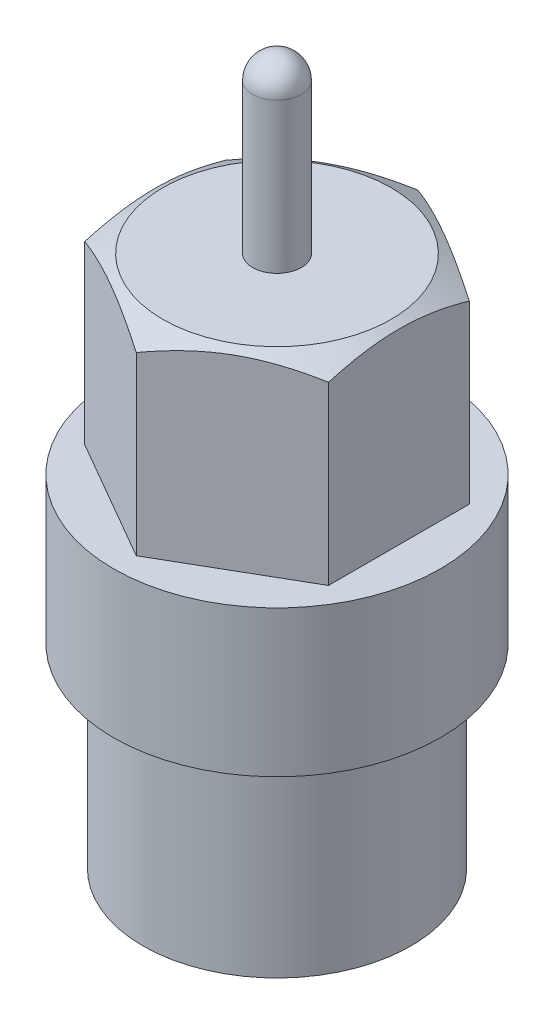
ISO-10303-21;
HEADER;
FILE_DESCRIPTION(('STEP AP214'),'2;1');
FILE_NAME('part.step','',(''),(''),'','','');
FILE_SCHEMA(('AUTOMOTIVE_DESIGN { 1 0 10303 214 1 1 1 1 }'));
ENDSEC;
DATA;
#1=APPLICATION_CONTEXT('core data for automotive mechanical design processes');
#2=APPLICATION_PROTOCOL_DEFINITION('international standard','automotive_design',2000,#1);
#3=PRODUCT_CONTEXT('',#1,'mechanical');
#4=PRODUCT('Part','Part','',(#3));
#5=PRODUCT_RELATED_PRODUCT_CATEGORY('part','',(#4));
#6=PRODUCT_DEFINITION_FORMATION('','',#4);
#7=PRODUCT_DEFINITION_CONTEXT('part definition',#1,'design');
#8=PRODUCT_DEFINITION('design','',#6,#7);
#9=PRODUCT_DEFINITION_SHAPE('','',#8);
#10=(LENGTH_UNIT() NAMED_UNIT(*) SI_UNIT(.MILLI.,.METRE.));
#11=(NAMED_UNIT(*) PLANE_ANGLE_UNIT() SI_UNIT($,.RADIAN.));
#12=(NAMED_UNIT(*) SI_UNIT($,.STERADIAN.) SOLID_ANGLE_UNIT());
#13=UNCERTAINTY_MEASURE_WITH_UNIT(LENGTH_MEASURE(1.E-05),#10,'distance_accuracy_value','');
#14=(GEOMETRIC_REPRESENTATION_CONTEXT(3) GLOBAL_UNCERTAINTY_ASSIGNED_CONTEXT((#13)) GLOBAL_UNIT_ASSIGNED_CONTEXT((#10,
#11,#12)) REPRESENTATION_CONTEXT('',''));
#15=CARTESIAN_POINT('',(0.,0.,0.));
#16=DIRECTION('',(0.,0.,1.));
#17=DIRECTION('',(1.,0.,0.));
#18=AXIS2_PLACEMENT_3D('',#15,#16,#17);
#19=CARTESIAN_POINT('',(-3.,7.,0.));
#20=DIRECTION('',(0.,1.,0.));
#21=DIRECTION('',(0.,0.,1.));
#22=AXIS2_PLACEMENT_3D('',#19,#20,#21);
#23=PLANE('',#22);
#24=CARTESIAN_POINT('',(0.,7.,0.));
#25=DIRECTION('',(0.,1.,0.));
#26=DIRECTION('',(0.,0.,1.));
#27=AXIS2_PLACEMENT_3D('',#24,#25,#26);
#28=CIRCLE('',#27,3.35219169135313);
#29=CARTESIAN_POINT('',(0.,7.,3.35219169135313));
#30=VERTEX_POINT('',#29);
#31=EDGE_CURVE('E134',#30,#30,#28,.T.);
#32=ORIENTED_EDGE('',*,*,#31,.T.);
#33=EDGE_LOOP('',(#32));
#34=FACE_BOUND('',#33,.T.);
#35=DIRECTION('',(-0.866025403784439,0.,0.5));
#36=VECTOR('',#35,1.);
#37=CARTESIAN_POINT('',(0.,7.,2.88675134594813));
#38=LINE('',#37,#36);
#39=CARTESIAN_POINT('',(2.5,7.,1.44337567297406));
#40=VERTEX_POINT('',#39);
#41=CARTESIAN_POINT('',(0.,7.,2.88675134594813));
#42=VERTEX_POINT('',#41);
#43=EDGE_CURVE('E99',#40,#42,#38,.T.);
#44=ORIENTED_EDGE('',*,*,#43,.T.);
#45=DIRECTION('',(-0.866025403784439,0.,-0.5));
#46=VECTOR('',#45,1.);
#47=CARTESIAN_POINT('',(-2.5,7.,1.44337567297406));
#48=LINE('',#47,#46);
#49=CARTESIAN_POINT('',(-2.5,7.,1.44337567297406));
#50=VERTEX_POINT('',#49);
#51=EDGE_CURVE('E91',#42,#50,#48,.T.);
#52=ORIENTED_EDGE('',*,*,#51,.T.);
#53=DIRECTION('',(0.,0.,-1.));
#54=VECTOR('',#53,1.);
#55=CARTESIAN_POINT('',(-2.5,7.,-1.44337567297406));
#56=LINE('',#55,#54);
#57=CARTESIAN_POINT('',(-2.5,7.,-1.44337567297406));
#58=VERTEX_POINT('',#57);
#59=EDGE_CURVE('E98',#50,#58,#56,.T.);
#60=ORIENTED_EDGE('',*,*,#59,.T.);
#61=DIRECTION('',(0.866025403784439,0.,-0.5));
#62=VECTOR('',#61,1.);
#63=CARTESIAN_POINT('',(0.,7.,-2.88675134594813));
#64=LINE('',#63,#62);
#65=CARTESIAN_POINT('',(0.,7.,-2.88675134594813));
#66=VERTEX_POINT('',#65);
#67=EDGE_CURVE('E316',#58,#66,#64,.T.);
#68=ORIENTED_EDGE('',*,*,#67,.T.);
#69=DIRECTION('',(0.866025403784439,0.,0.5));
#70=VECTOR('',#69,1.);
#71=CARTESIAN_POINT('',(2.5,7.,-1.44337567297407));
#72=LINE('',#71,#70);
#73=CARTESIAN_POINT('',(2.5,7.,-1.44337567297407));
#74=VERTEX_POINT('',#73);
#75=EDGE_CURVE('E318',#66,#74,#72,.T.);
#76=ORIENTED_EDGE('',*,*,#75,.T.);
#77=DIRECTION('',(0.,0.,1.));
#78=VECTOR('',#77,1.);
#79=CARTESIAN_POINT('',(2.5,7.,1.44337567297406));
#80=LINE('',#79,#78);
#81=EDGE_CURVE('E109',#74,#40,#80,.T.);
#82=ORIENTED_EDGE('',*,*,#81,.T.);
#83=EDGE_LOOP('',(#44,#52,#60,#68,#76,#82));
#84=FACE_BOUND('',#83,.T.);
#85=ADVANCED_FACE('F35',(#34,#84),#23,.T.);
#86=CARTESIAN_POINT('',(0.,14.9687648993492,0.));
#87=DIRECTION('',(0.,1.,0.));
#88=DIRECTION('',(0.,0.,1.));
#89=AXIS2_PLACEMENT_3D('',#86,#87,#88);
#90=CYLINDRICAL_SURFACE('',#89,3.35219169135313);
#91=CARTESIAN_POINT('',(0.,4.,0.));
#92=DIRECTION('',(0.,1.,0.));
#93=DIRECTION('',(0.,0.,1.));
#94=AXIS2_PLACEMENT_3D('',#91,#92,#93);
#95=CIRCLE('',#94,3.35219169135313);
#96=CARTESIAN_POINT('',(0.,4.,3.35219169135313));
#97=VERTEX_POINT('',#96);
#98=EDGE_CURVE('E131',#97,#97,#95,.T.);
#99=ORIENTED_EDGE('',*,*,#98,.T.);
#100=EDGE_LOOP('',(#99));
#101=FACE_BOUND('',#100,.T.);
#102=ORIENTED_EDGE('',*,*,#31,.F.);
#103=EDGE_LOOP('',(#102));
#104=FACE_BOUND('',#103,.T.);
#105=ADVANCED_FACE('F183',(#101,#104),#90,.T.);
#106=CARTESIAN_POINT('',(-2.75,4.,0.));
#107=DIRECTION('',(0.,-1.,0.));
#108=DIRECTION('',(0.,0.,-1.));
#109=AXIS2_PLACEMENT_3D('',#106,#107,#108);
#110=PLANE('',#109);
#111=CARTESIAN_POINT('',(0.,4.,0.));
#112=DIRECTION('',(0.,1.,0.));
#113=DIRECTION('',(0.,0.,1.));
#114=AXIS2_PLACEMENT_3D('',#111,#112,#113);
#115=CIRCLE('',#114,2.75);
#116=CARTESIAN_POINT('',(0.,4.,2.75));
#117=VERTEX_POINT('',#116);
#118=EDGE_CURVE('E128',#117,#117,#115,.T.);
#119=ORIENTED_EDGE('',*,*,#118,.T.);
#120=EDGE_LOOP('',(#119));
#121=FACE_BOUND('',#120,.T.);
#122=ORIENTED_EDGE('',*,*,#98,.F.);
#123=EDGE_LOOP('',(#122));
#124=FACE_BOUND('',#123,.T.);
#125=ADVANCED_FACE('F179',(#121,#124),#110,.T.);
#126=CARTESIAN_POINT('',(0.,14.9687648993492,0.));
#127=DIRECTION('',(0.,1.,0.));
#128=DIRECTION('',(0.,0.,1.));
#129=AXIS2_PLACEMENT_3D('',#126,#127,#128);
#130=CYLINDRICAL_SURFACE('',#129,2.75);
#131=CARTESIAN_POINT('',(0.,0.,0.));
#132=DIRECTION('',(0.,1.,0.));
#133=DIRECTION('',(0.,0.,1.));
#134=AXIS2_PLACEMENT_3D('',#131,#132,#133);
#135=CIRCLE('',#134,2.75);
#136=CARTESIAN_POINT('',(0.,0.,2.75));
#137=VERTEX_POINT('',#136);
#138=EDGE_CURVE('E125',#137,#137,#135,.T.);
#139=ORIENTED_EDGE('',*,*,#138,.T.);
#140=EDGE_LOOP('',(#139));
#141=FACE_BOUND('',#140,.T.);
#142=ORIENTED_EDGE('',*,*,#118,.F.);
#143=EDGE_LOOP('',(#142));
#144=FACE_BOUND('',#143,.T.);
#145=ADVANCED_FACE('F175',(#141,#144),#130,.T.);
#146=CARTESIAN_POINT('',(-0.531153926896968,0.,0.));
#147=DIRECTION('',(0.,-1.,0.));
#148=DIRECTION('',(0.,0.,-1.));
#149=AXIS2_PLACEMENT_3D('',#146,#147,#148);
#150=PLANE('',#149);
#151=CARTESIAN_POINT('',(0.,0.,0.));
#152=DIRECTION('',(0.,1.,0.));
#153=DIRECTION('',(0.,0.,1.));
#154=AXIS2_PLACEMENT_3D('',#151,#152,#153);
#155=CIRCLE('',#154,0.531153926896968);
#156=CARTESIAN_POINT('',(0.,0.,0.531153926896968));
#157=VERTEX_POINT('',#156);
#158=EDGE_CURVE('E122',#157,#157,#155,.T.);
#159=ORIENTED_EDGE('',*,*,#158,.T.);
#160=EDGE_LOOP('',(#159));
#161=FACE_BOUND('',#160,.T.);
#162=ORIENTED_EDGE('',*,*,#138,.F.);
#163=EDGE_LOOP('',(#162));
#164=FACE_BOUND('',#163,.T.);
#165=ADVANCED_FACE('F172',(#161,#164),#150,.T.);
#166=CARTESIAN_POINT('',(0.,0.,0.));
#167=DIRECTION('',(0.,1.,0.));
#168=DIRECTION('',(0.,0.,1.));
#169=AXIS2_PLACEMENT_3D('',#166,#167,#168);
#170=CONICAL_SURFACE('',#169,0.531153926896968,0.586114206613113);
#171=CARTESIAN_POINT('',(0.,-0.8,0.));
#172=VERTEX_POINT('',#171);
#173=VERTEX_LOOP('',#172);
#174=FACE_BOUND('',#173,.T.);
#175=ORIENTED_EDGE('',*,*,#158,.F.);
#176=EDGE_LOOP('',(#175));
#177=FACE_BOUND('',#176,.T.);
#178=ADVANCED_FACE('F169',(#174,#177),#170,.T.);
#179=CARTESIAN_POINT('',(0.,-2.57624420624372,2.88675134594813));
#180=DIRECTION('',(0.5,0.,0.866025403784438));
#181=DIRECTION('',(0.866025403784439,0.,-0.5));
#182=AXIS2_PLACEMENT_3D('',#179,#180,#181);
#183=PLANE('',#182);
#184=DIRECTION('',(0.,1.,0.));
#185=VECTOR('',#184,1.);
#186=CARTESIAN_POINT('',(0.,-2.57624420624372,2.88675134594813));
#187=LINE('',#186,#185);
#188=CARTESIAN_POINT('',(0.,10.6090012369322,2.88675134594813));
#189=VERTEX_POINT('',#188);
#190=EDGE_CURVE('E54',#42,#189,#187,.T.);
#191=ORIENTED_EDGE('',*,*,#190,.F.);
#192=ORIENTED_EDGE('',*,*,#43,.F.);
#193=DIRECTION('',(0.,1.,0.));
#194=VECTOR('',#193,1.);
#195=CARTESIAN_POINT('',(2.5,-2.57624420624372,1.44337567297406));
#196=LINE('',#195,#194);
#197=CARTESIAN_POINT('',(2.5,10.6090012369322,1.44337567297406));
#198=VERTEX_POINT('',#197);
#199=EDGE_CURVE('E106',#40,#198,#196,.T.);
#200=ORIENTED_EDGE('',*,*,#199,.T.);
#201=CARTESIAN_POINT('',(-0.000199999999998882,10.6089345662657,2.88686681600197));
#202=CARTESIAN_POINT('',(0.109663234734873,10.6455706105172,2.82343724785375));
#203=CARTESIAN_POINT('',(0.220474799896527,10.6788900116597,2.75946016087834));
#204=CARTESIAN_POINT('',(0.444016833466051,10.7370499450669,2.63039810762178));
#205=CARTESIAN_POINT('',(0.55675127452839,10.761869901477,2.5653108477275));
#206=CARTESIAN_POINT('',(0.780822993875271,10.8005065791837,2.43594298024479));
#207=CARTESIAN_POINT('',(0.892125791767379,10.8145804344391,2.37168227992022));
#208=CARTESIAN_POINT('',(1.11525522746834,10.831383078272,2.24285844015415));
#209=CARTESIAN_POINT('',(1.22708105401423,10.8341257794212,2.17829576909552));
#210=CARTESIAN_POINT('',(1.43604197555152,10.8284264706167,2.05765212479586));
#211=CARTESIAN_POINT('',(1.53320831755773,10.8213838362429,2.0015531110824));
#212=CARTESIAN_POINT('',(1.726907949711,10.7990608114998,1.88972057631678));
#213=CARTESIAN_POINT('',(1.82344056965973,10.7837727921845,1.8339874422038));
#214=CARTESIAN_POINT('',(2.01753972174048,10.7455531367804,1.7219242445005));
#215=CARTESIAN_POINT('',(2.11508168178214,10.7224594544993,1.66560836761316));
#216=CARTESIAN_POINT('',(2.30871060807609,10.6700455740469,1.55381665489446));
#217=CARTESIAN_POINT('',(2.40480005588618,10.6407376950002,1.49833938633502));
#218=CARTESIAN_POINT('',(2.5002,10.6089345662657,1.44326020292023));
#219=B_SPLINE_CURVE_WITH_KNOTS('',3,(#201,#202,#203,#204,#205,#206,#207,#208,#209,#210,#211,
#212,#213,#214,#215,#216,#217,#218),.UNSPECIFIED.,.F.,.F.,(4,2,2,2,2,2,2,2,4),(0.,
0.396285827362227,0.793524330152052,1.18093086852114,1.56786160134476,1.90479741793733,
2.24204551660463,2.58677531536756,2.93082800105256),.UNSPECIFIED.);
#220=EDGE_CURVE('E12',#189,#198,#219,.T.);
#221=ORIENTED_EDGE('',*,*,#220,.F.);
#222=EDGE_LOOP('',(#191,#192,#200,#221));
#223=FACE_BOUND('',#222,.T.);
#224=ADVANCED_FACE('F102',(#223),#183,.T.);
#225=CARTESIAN_POINT('',(2.5,-2.57624420624372,1.44337567297406));
#226=DIRECTION('',(1.,0.,0.));
#227=DIRECTION('',(0.,0.,-1.));
#228=AXIS2_PLACEMENT_3D('',#225,#226,#227);
#229=PLANE('',#228);
#230=ORIENTED_EDGE('',*,*,#199,.F.);
#231=ORIENTED_EDGE('',*,*,#81,.F.);
#232=DIRECTION('',(0.,1.,0.));
#233=VECTOR('',#232,1.);
#234=CARTESIAN_POINT('',(2.5,-2.57624420624372,-1.44337567297407));
#235=LINE('',#234,#233);
#236=CARTESIAN_POINT('',(2.5,10.6090012369322,-1.44337567297407));
#237=VERTEX_POINT('',#236);
#238=EDGE_CURVE('E326',#74,#237,#235,.T.);
#239=ORIENTED_EDGE('',*,*,#238,.T.);
#240=CARTESIAN_POINT('',(2.5,9.63775203197999,-3.82436928619818));
#241=CARTESIAN_POINT('',(2.5,9.69029804544711,-3.71560541876863));
#242=CARTESIAN_POINT('',(2.5,9.74232471034108,-3.60658612397464));
#243=CARTESIAN_POINT('',(2.5,9.84504611961405,-3.38790062702491));
#244=CARTESIAN_POINT('',(2.5,9.89574064297451,-3.27823432117214));
#245=CARTESIAN_POINT('',(2.5,9.9957709866026,-3.05752799371934));
#246=CARTESIAN_POINT('',(2.5,10.0450974272333,-2.94648370576985));
#247=CARTESIAN_POINT('',(2.5,10.1416598164791,-2.72349319987992));
#248=CARTESIAN_POINT('',(2.5,10.1888958676455,-2.61154702650374));
#249=CARTESIAN_POINT('',(2.5,10.2821103237927,-2.38317772143622));
#250=CARTESIAN_POINT('',(2.5,10.3280078426014,-2.26672138738359));
#251=CARTESIAN_POINT('',(2.5,10.4161997317468,-2.03242691722103));
#252=CARTESIAN_POINT('',(2.5,10.4584936904934,-1.91458862501114));
#253=CARTESIAN_POINT('',(2.5,10.5383293848891,-1.67758095989367));
#254=CARTESIAN_POINT('',(2.5,10.5758812152851,-1.55841502289388));
#255=CARTESIAN_POINT('',(2.5,10.6449930927758,-1.31837509764331));
#256=CARTESIAN_POINT('',(2.5,10.6765550838859,-1.19750167729124));
#257=CARTESIAN_POINT('',(2.5,10.7319745410874,-0.954635078784878));
#258=CARTESIAN_POINT('',(2.5,10.7558715213596,-0.832651089996438));
#259=CARTESIAN_POINT('',(2.5,10.7945731423488,-0.587223191703026));
#260=CARTESIAN_POINT('',(2.5,10.8093785414912,-0.463779404851219));
#261=CARTESIAN_POINT('',(2.5,10.8285213305091,-0.217637993546147));
#262=CARTESIAN_POINT('',(2.5,10.8329891091422,-0.0949507635763036));
#263=CARTESIAN_POINT('',(2.5,10.8314180689393,0.150364917265022));
#264=CARTESIAN_POINT('',(2.5,10.8253789209815,0.272993366174872));
#265=CARTESIAN_POINT('',(2.5,10.8064790079081,0.482777366490869));
#266=CARTESIAN_POINT('',(2.5,10.7960288976567,0.57016225131682));
#267=CARTESIAN_POINT('',(2.5,10.7704734391882,0.74425493369405));
#268=CARTESIAN_POINT('',(2.5,10.7553674123021,0.830962630644654));
#269=CARTESIAN_POINT('',(2.5,10.7038616567399,1.08996524967496));
#270=CARTESIAN_POINT('',(2.5,10.6612848884131,1.26103505157086));
#271=CARTESIAN_POINT('',(2.5,10.5631715451488,1.60329608713349));
#272=CARTESIAN_POINT('',(2.5,10.5073736982879,1.77440933961331));
#273=CARTESIAN_POINT('',(2.5,10.3871980492575,2.11349114517199));
#274=CARTESIAN_POINT('',(2.5,10.3228228890675,2.28146064848992));
#275=CARTESIAN_POINT('',(2.5,10.2121032928986,2.55553059032251));
#276=CARTESIAN_POINT('',(2.5,10.1675079359126,2.66234918305649));
#277=CARTESIAN_POINT('',(2.5,10.0763256007896,2.87513467073338));
#278=CARTESIAN_POINT('',(2.5,10.0297385893085,2.98110155138173));
#279=CARTESIAN_POINT('',(2.5,9.88758444580172,3.29797019153017));
#280=CARTESIAN_POINT('',(2.5,9.78963946176046,3.50780301085414));
#281=CARTESIAN_POINT('',(2.5,9.58946726527467,3.92562559407122));
#282=CARTESIAN_POINT('',(2.5,9.4872363227355,4.13361355332824));
#283=CARTESIAN_POINT('',(2.5,9.27984883620772,4.54812974436396));
#284=CARTESIAN_POINT('',(2.5,9.17469220435385,4.75465793206823));
#285=CARTESIAN_POINT('',(2.5,8.97060649120626,5.15049181953925));
#286=CARTESIAN_POINT('',(2.5,8.87183503104251,5.33987904901395));
#287=CARTESIAN_POINT('',(2.5,8.6729424574981,5.71794978029189));
#288=CARTESIAN_POINT('',(2.5,8.57282130465768,5.90663326131348));
#289=CARTESIAN_POINT('',(2.5,8.37176381157511,6.28303318956914));
#290=CARTESIAN_POINT('',(2.5,8.27082973915809,6.47075084992785));
#291=CARTESIAN_POINT('',(2.5,8.06814305067557,6.8457321316033));
#292=CARTESIAN_POINT('',(2.5,7.96639047468291,7.03299577457095));
#293=CARTESIAN_POINT('',(2.5,7.86433006891239,7.22009033705315));
#294=B_SPLINE_CURVE_WITH_KNOTS('',3,(#240,#241,#242,#243,#244,#245,#246,#247,#248,#249,#250,
#251,#252,#253,#254,#255,#256,#257,#258,#259,#260,#261,#262,#263,#264,#265,#266,#267,#268,#269,
#270,#271,#272,#273,#274,#275,#276,#277,#278,#279,#280,#281,#282,#283,#284,#285,#286,#287,#288,
#289,#290,#291,#292,#293),.UNSPECIFIED.,.F.,.F.,(4,2,2,2,2,2,2,2,2,2,2,2,2,2,2,2,2,2,2,2,2,2,2,
2,2,2,4),(0.,0.362380137569459,0.724820023600681,1.08932356411329,1.45380920278696,
1.82928670252166,2.20480703107002,2.57951399440462,2.95409913702143,3.32672099191255,
3.6993117582322,4.06717678713954,4.43505333935758,4.69894774861289,4.96288064259475,
5.49106054084683,6.03070636804056,6.57018635643589,6.91742987498311,7.26467920931308,
7.95929771516193,8.65453383857819,9.349790864141,9.99057298691808,10.6313738844753,
11.2707702150302,11.9101354298418),.UNSPECIFIED.);
#295=EDGE_CURVE('E47',#198,#237,#294,.F.);
#296=ORIENTED_EDGE('',*,*,#295,.F.);
#297=EDGE_LOOP('',(#230,#231,#239,#296));
#298=FACE_BOUND('',#297,.T.);
#299=ADVANCED_FACE('F222',(#298),#229,.T.);
#300=CARTESIAN_POINT('',(2.5,-2.57624420624372,-1.44337567297407));
#301=DIRECTION('',(0.5,0.,-0.866025403784439));
#302=DIRECTION('',(-0.866025403784439,0.,-0.5));
#303=AXIS2_PLACEMENT_3D('',#300,#301,#302);
#304=PLANE('',#303);
#305=ORIENTED_EDGE('',*,*,#238,.F.);
#306=ORIENTED_EDGE('',*,*,#75,.F.);
#307=DIRECTION('',(0.,1.,0.));
#308=VECTOR('',#307,1.);
#309=CARTESIAN_POINT('',(0.,-2.57624420624372,-2.88675134594813));
#310=LINE('',#309,#308);
#311=CARTESIAN_POINT('',(0.,10.6090012369322,-2.88675134594813));
#312=VERTEX_POINT('',#311);
#313=EDGE_CURVE('E323',#66,#312,#310,.T.);
#314=ORIENTED_EDGE('',*,*,#313,.T.);
#315=CARTESIAN_POINT('',(2.5002,10.6089345662657,-1.44326020292023));
#316=CARTESIAN_POINT('',(2.39033676526513,10.6455706105172,-1.50668977106845));
#317=CARTESIAN_POINT('',(2.27952520010347,10.6788900116597,-1.57066685804385));
#318=CARTESIAN_POINT('',(2.05598316653395,10.7370499450669,-1.69972891130041));
#319=CARTESIAN_POINT('',(1.94324872547161,10.761869901477,-1.7648161711947));
#320=CARTESIAN_POINT('',(1.71917700612473,10.8005065791837,-1.8941840386774));
#321=CARTESIAN_POINT('',(1.60787420823262,10.8145804344391,-1.95844473900197));
#322=CARTESIAN_POINT('',(1.38474477253167,10.831383078272,-2.08726857876805));
#323=CARTESIAN_POINT('',(1.27291894598577,10.8341257794212,-2.15183124982667));
#324=CARTESIAN_POINT('',(1.06395802444848,10.8284264706167,-2.27247489412634));
#325=CARTESIAN_POINT('',(0.966791682442268,10.8213838362429,-2.32857390783979));
#326=CARTESIAN_POINT('',(0.773092050288996,10.7990608114998,-2.44040644260542));
#327=CARTESIAN_POINT('',(0.676559430340267,10.7837727921845,-2.4961395767184));
#328=CARTESIAN_POINT('',(0.482460278259523,10.7455531367804,-2.60820277442169));
#329=CARTESIAN_POINT('',(0.384918318217859,10.7224594544993,-2.66451865130903));
#330=CARTESIAN_POINT('',(0.191289391923914,10.6700455740469,-2.77631036402774));
#331=CARTESIAN_POINT('',(0.0951999441138235,10.6407376950002,-2.83178763258718));
#332=CARTESIAN_POINT('',(-0.000200000000000085,10.6089345662657,-2.88686681600197));
#333=B_SPLINE_CURVE_WITH_KNOTS('',3,(#315,#316,#317,#318,#319,#320,#321,#322,#323,#324,#325,
#326,#327,#328,#329,#330,#331,#332),.UNSPECIFIED.,.F.,.F.,(4,2,2,2,2,2,2,2,4),(0.,
0.396285827362227,0.793524330152052,1.18093086852114,1.56786160134476,1.90479741793733,
2.24204551660463,2.58677531536756,2.93082800105256),.UNSPECIFIED.);
#334=EDGE_CURVE('E330',#237,#312,#333,.T.);
#335=ORIENTED_EDGE('',*,*,#334,.F.);
#336=EDGE_LOOP('',(#305,#306,#314,#335));
#337=FACE_BOUND('',#336,.T.);
#338=ADVANCED_FACE('F228',(#337),#304,.T.);
#339=CARTESIAN_POINT('',(0.,-2.57624420624372,-2.88675134594813));
#340=DIRECTION('',(-0.5,0.,-0.866025403784438));
#341=DIRECTION('',(-0.866025403784439,0.,0.5));
#342=AXIS2_PLACEMENT_3D('',#339,#340,#341);
#343=PLANE('',#342);
#344=ORIENTED_EDGE('',*,*,#313,.F.);
#345=ORIENTED_EDGE('',*,*,#67,.F.);
#346=DIRECTION('',(0.,1.,0.));
#347=VECTOR('',#346,1.);
#348=CARTESIAN_POINT('',(-2.5,-2.57624420624372,-1.44337567297406));
#349=LINE('',#348,#347);
#350=CARTESIAN_POINT('',(-2.5,10.6090012369322,-1.44337567297406));
#351=VERTEX_POINT('',#350);
#352=EDGE_CURVE('E112',#58,#351,#349,.T.);
#353=ORIENTED_EDGE('',*,*,#352,.T.);
#354=CARTESIAN_POINT('',(0.000199999999999924,10.6089345662657,-2.88686681600197));
#355=CARTESIAN_POINT('',(-0.109663234734871,10.6455706105172,-2.82343724785375));
#356=CARTESIAN_POINT('',(-0.220474799896526,10.6788900116597,-2.75946016087834));
#357=CARTESIAN_POINT('',(-0.444016833466051,10.7370499450669,-2.63039810762178));
#358=CARTESIAN_POINT('',(-0.556751274528389,10.761869901477,-2.5653108477275));
#359=CARTESIAN_POINT('',(-0.78082299387527,10.8005065791837,-2.43594298024479));
#360=CARTESIAN_POINT('',(-0.892125791767378,10.8145804344391,-2.37168227992023));
#361=CARTESIAN_POINT('',(-1.11525522746833,10.831383078272,-2.24285844015415));
#362=CARTESIAN_POINT('',(-1.22708105401423,10.8341257794212,-2.17829576909553));
#363=CARTESIAN_POINT('',(-1.43604197555152,10.8284264706167,-2.05765212479586));
#364=CARTESIAN_POINT('',(-1.53320831755773,10.8213838362429,-2.0015531110824));
#365=CARTESIAN_POINT('',(-1.726907949711,10.7990608114998,-1.88972057631678));
#366=CARTESIAN_POINT('',(-1.82344056965973,10.7837727921845,-1.8339874422038));
#367=CARTESIAN_POINT('',(-2.01753972174048,10.7455531367804,-1.7219242445005));
#368=CARTESIAN_POINT('',(-2.11508168178214,10.7224594544993,-1.66560836761316));
#369=CARTESIAN_POINT('',(-2.30871060807609,10.6700455740469,-1.55381665489446));
#370=CARTESIAN_POINT('',(-2.40480005588618,10.6407376950002,-1.49833938633502));
#371=CARTESIAN_POINT('',(-2.5002,10.6089345662657,-1.44326020292023));
#372=B_SPLINE_CURVE_WITH_KNOTS('',3,(#354,#355,#356,#357,#358,#359,#360,#361,#362,#363,#364,
#365,#366,#367,#368,#369,#370,#371),.UNSPECIFIED.,.F.,.F.,(4,2,2,2,2,2,2,2,4),(0.,
0.396285827362228,0.793524330152052,1.18093086852114,1.56786160134476,1.90479741793733,
2.24204551660463,2.58677531536756,2.93082800105257),.UNSPECIFIED.);
#373=EDGE_CURVE('E331',#312,#351,#372,.T.);
#374=ORIENTED_EDGE('',*,*,#373,.F.);
#375=EDGE_LOOP('',(#344,#345,#353,#374));
#376=FACE_BOUND('',#375,.T.);
#377=ADVANCED_FACE('F235',(#376),#343,.T.);
#378=CARTESIAN_POINT('',(-2.5,-2.57624420624372,-1.44337567297406));
#379=DIRECTION('',(-1.,0.,0.));
#380=DIRECTION('',(0.,0.,1.));
#381=AXIS2_PLACEMENT_3D('',#378,#379,#380);
#382=PLANE('',#381);
#383=ORIENTED_EDGE('',*,*,#352,.F.);
#384=ORIENTED_EDGE('',*,*,#59,.F.);
#385=DIRECTION('',(0.,1.,0.));
#386=VECTOR('',#385,1.);
#387=CARTESIAN_POINT('',(-2.5,-2.57624420624372,1.44337567297406));
#388=LINE('',#387,#386);
#389=CARTESIAN_POINT('',(-2.5,10.6090012369322,1.44337567297406));
#390=VERTEX_POINT('',#389);
#391=EDGE_CURVE('E94',#50,#390,#388,.T.);
#392=ORIENTED_EDGE('',*,*,#391,.T.);
#393=CARTESIAN_POINT('',(-2.5,9.63775203197999,-3.82436928619818));
#394=CARTESIAN_POINT('',(-2.5,9.6902980454471,-3.71560541876863));
#395=CARTESIAN_POINT('',(-2.5,9.74232471034108,-3.60658612397464));
#396=CARTESIAN_POINT('',(-2.5,9.84504611961405,-3.38790062702491));
#397=CARTESIAN_POINT('',(-2.5,9.89574064297451,-3.27823432117214));
#398=CARTESIAN_POINT('',(-2.5,9.9957709866026,-3.05752799371934));
#399=CARTESIAN_POINT('',(-2.5,10.0450974272333,-2.94648370576985));
#400=CARTESIAN_POINT('',(-2.5,10.1416598164791,-2.72349319987991));
#401=CARTESIAN_POINT('',(-2.5,10.1888958676455,-2.61154702650374));
#402=CARTESIAN_POINT('',(-2.5,10.2821103237927,-2.38317772143622));
#403=CARTESIAN_POINT('',(-2.5,10.3280078426014,-2.26672138738359));
#404=CARTESIAN_POINT('',(-2.5,10.4161997317468,-2.03242691722103));
#405=CARTESIAN_POINT('',(-2.5,10.4584936904934,-1.91458862501114));
#406=CARTESIAN_POINT('',(-2.5,10.5383293848891,-1.67758095989367));
#407=CARTESIAN_POINT('',(-2.5,10.5758812152851,-1.55841502289388));
#408=CARTESIAN_POINT('',(-2.5,10.6449930927758,-1.31837509764331));
#409=CARTESIAN_POINT('',(-2.5,10.6765550838859,-1.19750167729124));
#410=CARTESIAN_POINT('',(-2.5,10.7319745410874,-0.954635078784877));
#411=CARTESIAN_POINT('',(-2.5,10.7558715213596,-0.832651089996436));
#412=CARTESIAN_POINT('',(-2.5,10.7945731423488,-0.587223191703025));
#413=CARTESIAN_POINT('',(-2.5,10.8093785414912,-0.463779404851218));
#414=CARTESIAN_POINT('',(-2.5,10.8285213305091,-0.217637993546145));
#415=CARTESIAN_POINT('',(-2.5,10.8329891091422,-0.0949507635763021));
#416=CARTESIAN_POINT('',(-2.5,10.8314180689393,0.150364917265023));
#417=CARTESIAN_POINT('',(-2.5,10.8253789209815,0.272993366174873));
#418=CARTESIAN_POINT('',(-2.5,10.8064790079081,0.482777366490869));
#419=CARTESIAN_POINT('',(-2.5,10.7960288976567,0.570162251316821));
#420=CARTESIAN_POINT('',(-2.5,10.7704734391882,0.744254933694051));
#421=CARTESIAN_POINT('',(-2.5,10.7553674123021,0.830962630644655));
#422=CARTESIAN_POINT('',(-2.5,10.7038616567399,1.08996524967496));
#423=CARTESIAN_POINT('',(-2.5,10.6612848884131,1.26103505157086));
#424=CARTESIAN_POINT('',(-2.5,10.5631715451488,1.60329608713349));
#425=CARTESIAN_POINT('',(-2.5,10.5073736982879,1.77440933961331));
#426=CARTESIAN_POINT('',(-2.5,10.3871980492575,2.11349114517199));
#427=CARTESIAN_POINT('',(-2.5,10.3228228890675,2.28146064848993));
#428=CARTESIAN_POINT('',(-2.5,10.2121032928986,2.55553059032251));
#429=CARTESIAN_POINT('',(-2.5,10.1675079359126,2.66234918305649));
#430=CARTESIAN_POINT('',(-2.5,10.0763256007896,2.87513467073338));
#431=CARTESIAN_POINT('',(-2.5,10.0297385893085,2.98110155138174));
#432=CARTESIAN_POINT('',(-2.5,9.88758444580172,3.29797019153017));
#433=CARTESIAN_POINT('',(-2.5,9.78963946176046,3.50780301085414));
#434=CARTESIAN_POINT('',(-2.5,9.58946726527467,3.92562559407122));
#435=CARTESIAN_POINT('',(-2.5,9.4872363227355,4.13361355332824));
#436=CARTESIAN_POINT('',(-2.5,9.27984883620772,4.54812974436396));
#437=CARTESIAN_POINT('',(-2.5,9.17469220435385,4.75465793206823));
#438=CARTESIAN_POINT('',(-2.5,8.97060649120626,5.15049181953925));
#439=CARTESIAN_POINT('',(-2.5,8.87183503104251,5.33987904901395));
#440=CARTESIAN_POINT('',(-2.5,8.6729424574981,5.71794978029189));
#441=CARTESIAN_POINT('',(-2.5,8.57282130465768,5.90663326131348));
#442=CARTESIAN_POINT('',(-2.5,8.37176381157511,6.28303318956914));
#443=CARTESIAN_POINT('',(-2.5,8.27082973915809,6.47075084992785));
#444=CARTESIAN_POINT('',(-2.5,8.06814305067557,6.8457321316033));
#445=CARTESIAN_POINT('',(-2.5,7.96639047468291,7.03299577457096));
#446=CARTESIAN_POINT('',(-2.5,7.86433006891239,7.22009033705316));
#447=B_SPLINE_CURVE_WITH_KNOTS('',3,(#393,#394,#395,#396,#397,#398,#399,#400,#401,#402,#403,
#404,#405,#406,#407,#408,#409,#410,#411,#412,#413,#414,#415,#416,#417,#418,#419,#420,#421,#422,
#423,#424,#425,#426,#427,#428,#429,#430,#431,#432,#433,#434,#435,#436,#437,#438,#439,#440,#441,
#442,#443,#444,#445,#446),.UNSPECIFIED.,.F.,.F.,(4,2,2,2,2,2,2,2,2,2,2,2,2,2,2,2,2,2,2,2,2,2,2,
2,2,2,4),(0.,0.362380137569459,0.724820023600681,1.08932356411329,1.45380920278696,
1.82928670252166,2.20480703107002,2.57951399440462,2.95409913702143,3.32672099191255,
3.6993117582322,4.06717678713954,4.43505333935758,4.69894774861289,4.96288064259475,
5.49106054084683,6.03070636804056,6.57018635643589,6.91742987498311,7.26467920931308,
7.95929771516193,8.65453383857819,9.349790864141,9.99057298691808,10.6313738844753,
11.2707702150302,11.9101354298418),.UNSPECIFIED.);
#448=EDGE_CURVE('E146',#351,#390,#447,.T.);
#449=ORIENTED_EDGE('',*,*,#448,.F.);
#450=EDGE_LOOP('',(#383,#384,#392,#449));
#451=FACE_BOUND('',#450,.T.);
#452=ADVANCED_FACE('F159',(#451),#382,.T.);
#453=CARTESIAN_POINT('',(-2.5,-2.57624420624372,1.44337567297406));
#454=DIRECTION('',(-0.5,0.,0.866025403784439));
#455=DIRECTION('',(0.866025403784439,0.,0.5));
#456=AXIS2_PLACEMENT_3D('',#453,#454,#455);
#457=PLANE('',#456);
#458=ORIENTED_EDGE('',*,*,#391,.F.);
#459=ORIENTED_EDGE('',*,*,#51,.F.);
#460=ORIENTED_EDGE('',*,*,#190,.T.);
#461=CARTESIAN_POINT('',(-2.5002,10.6089345662657,1.44326020292023));
#462=CARTESIAN_POINT('',(-2.39033676526513,10.6455706105172,1.50668977106845));
#463=CARTESIAN_POINT('',(-2.27952520010347,10.6788900116597,1.57066685804385));
#464=CARTESIAN_POINT('',(-2.05598316653395,10.7370499450669,1.69972891130041));
#465=CARTESIAN_POINT('',(-1.94324872547161,10.761869901477,1.7648161711947));
#466=CARTESIAN_POINT('',(-1.71917700612473,10.8005065791837,1.8941840386774));
#467=CARTESIAN_POINT('',(-1.60787420823262,10.8145804344391,1.95844473900197));
#468=CARTESIAN_POINT('',(-1.38474477253167,10.831383078272,2.08726857876804));
#469=CARTESIAN_POINT('',(-1.27291894598577,10.8341257794212,2.15183124982667));
#470=CARTESIAN_POINT('',(-1.06395802444848,10.8284264706167,2.27247489412634));
#471=CARTESIAN_POINT('',(-0.966791682442268,10.8213838362429,2.32857390783979));
#472=CARTESIAN_POINT('',(-0.773092050288997,10.7990608114998,2.44040644260542));
#473=CARTESIAN_POINT('',(-0.676559430340267,10.7837727921845,2.49613957671839));
#474=CARTESIAN_POINT('',(-0.482460278259523,10.7455531367804,2.60820277442169));
#475=CARTESIAN_POINT('',(-0.384918318217859,10.7224594544993,2.66451865130903));
#476=CARTESIAN_POINT('',(-0.191289391923914,10.6700455740469,2.77631036402774));
#477=CARTESIAN_POINT('',(-0.095199944113823,10.6407376950002,2.83178763258717));
#478=CARTESIAN_POINT('',(0.000200000000001195,10.6089345662657,2.88686681600197));
#479=B_SPLINE_CURVE_WITH_KNOTS('',3,(#461,#462,#463,#464,#465,#466,#467,#468,#469,#470,#471,
#472,#473,#474,#475,#476,#477,#478),.UNSPECIFIED.,.F.,.F.,(4,2,2,2,2,2,2,2,4),(0.,
0.396285827362227,0.793524330152052,1.18093086852114,1.56786160134476,1.90479741793733,
2.24204551660463,2.58677531536756,2.93082800105257),.UNSPECIFIED.);
#480=EDGE_CURVE('E140',#390,#189,#479,.T.);
#481=ORIENTED_EDGE('',*,*,#480,.F.);
#482=EDGE_LOOP('',(#458,#459,#460,#481));
#483=FACE_BOUND('',#482,.T.);
#484=ADVANCED_FACE('F92',(#483),#457,.T.);
#485=CARTESIAN_POINT('',(0.,14.,0.));
#486=DIRECTION('',(0.,1.,0.));
#487=DIRECTION('',(1.,0.,0.));
#488=AXIS2_PLACEMENT_3D('',#485,#486,#487);
#489=SPHERICAL_SURFACE('',#488,0.5);
#490=CARTESIAN_POINT('',(0.,14.,0.));
#491=DIRECTION('',(0.,1.,0.));
#492=DIRECTION('',(0.,0.,1.));
#493=AXIS2_PLACEMENT_3D('',#490,#491,#492);
#494=CIRCLE('',#493,0.5);
#495=CARTESIAN_POINT('',(0.,14.,0.5));
#496=VERTEX_POINT('',#495);
#497=EDGE_CURVE('E119',#496,#496,#494,.T.);
#498=ORIENTED_EDGE('',*,*,#497,.T.);
#499=EDGE_LOOP('',(#498));
#500=FACE_BOUND('',#499,.T.);
#501=ADVANCED_FACE('F158',(#500),#489,.T.);
#502=CARTESIAN_POINT('',(0.,14.9687648993492,0.));
#503=DIRECTION('',(0.,1.,0.));
#504=DIRECTION('',(0.,0.,1.));
#505=AXIS2_PLACEMENT_3D('',#502,#503,#504);
#506=CYLINDRICAL_SURFACE('',#505,0.5);
#507=CARTESIAN_POINT('',(0.,10.9241860471174,0.));
#508=DIRECTION('',(0.,1.,0.));
#509=DIRECTION('',(0.,0.,1.));
#510=AXIS2_PLACEMENT_3D('',#507,#508,#509);
#511=CIRCLE('',#510,0.5);
#512=CARTESIAN_POINT('',(0.,10.9241860471174,0.5));
#513=VERTEX_POINT('',#512);
#514=EDGE_CURVE('E116',#513,#513,#511,.T.);
#515=ORIENTED_EDGE('',*,*,#514,.T.);
#516=EDGE_LOOP('',(#515));
#517=FACE_BOUND('',#516,.T.);
#518=ORIENTED_EDGE('',*,*,#497,.F.);
#519=EDGE_LOOP('',(#518));
#520=FACE_BOUND('',#519,.T.);
#521=ADVANCED_FACE('F162',(#517,#520),#506,.T.);
#522=CARTESIAN_POINT('',(-0.5,10.9241860471174,0.));
#523=DIRECTION('',(0.,1.,0.));
#524=DIRECTION('',(0.,0.,1.));
#525=AXIS2_PLACEMENT_3D('',#522,#523,#524);
#526=PLANE('',#525);
#527=CARTESIAN_POINT('',(0.,10.9241860471174,0.));
#528=DIRECTION('',(0.,1.,0.));
#529=DIRECTION('',(0.,0.,1.));
#530=AXIS2_PLACEMENT_3D('',#527,#528,#529);
#531=CIRCLE('',#530,2.34083524093335);
#532=CARTESIAN_POINT('',(0.,10.9241860471174,2.34083524093335));
#533=VERTEX_POINT('',#532);
#534=EDGE_CURVE('E137',#533,#533,#531,.T.);
#535=ORIENTED_EDGE('',*,*,#534,.T.);
#536=EDGE_LOOP('',(#535));
#537=FACE_BOUND('',#536,.T.);
#538=ORIENTED_EDGE('',*,*,#514,.F.);
#539=EDGE_LOOP('',(#538));
#540=FACE_BOUND('',#539,.T.);
#541=ADVANCED_FACE('F37',(#537,#540),#526,.T.);
#542=CARTESIAN_POINT('',(0.,10.9241860471174,0.));
#543=DIRECTION('',(0.,-1.,0.));
#544=DIRECTION('',(0.,0.,-1.));
#545=AXIS2_PLACEMENT_3D('',#542,#543,#544);
#546=CONICAL_SURFACE('',#545,2.34083524093335,1.0471975511966);
#547=ORIENTED_EDGE('',*,*,#534,.F.);
#548=EDGE_LOOP('',(#547));
#549=FACE_BOUND('',#548,.T.);
#550=ORIENTED_EDGE('',*,*,#480,.T.);
#551=ORIENTED_EDGE('',*,*,#220,.T.);
#552=ORIENTED_EDGE('',*,*,#295,.T.);
#553=ORIENTED_EDGE('',*,*,#334,.T.);
#554=ORIENTED_EDGE('',*,*,#373,.T.);
#555=ORIENTED_EDGE('',*,*,#448,.T.);
#556=EDGE_LOOP('',(#550,#551,#552,#553,#554,#555));
#557=FACE_BOUND('',#556,.T.);
#558=ADVANCED_FACE('F152',(#549,#557),#546,.T.);
#559=CLOSED_SHELL('',(#85,#105,#125,#145,#165,#178,#224,#299,#338,#377,#452,#484,#501,#521,#541,#558));
#560=MANIFOLD_SOLID_BREP('B2',#559);
#561=ADVANCED_BREP_SHAPE_REPRESENTATION('',(#18,#560),#14);
#562=SHAPE_DEFINITION_REPRESENTATION(#9,#561);
ENDSEC;
END-ISO-10303-21;
